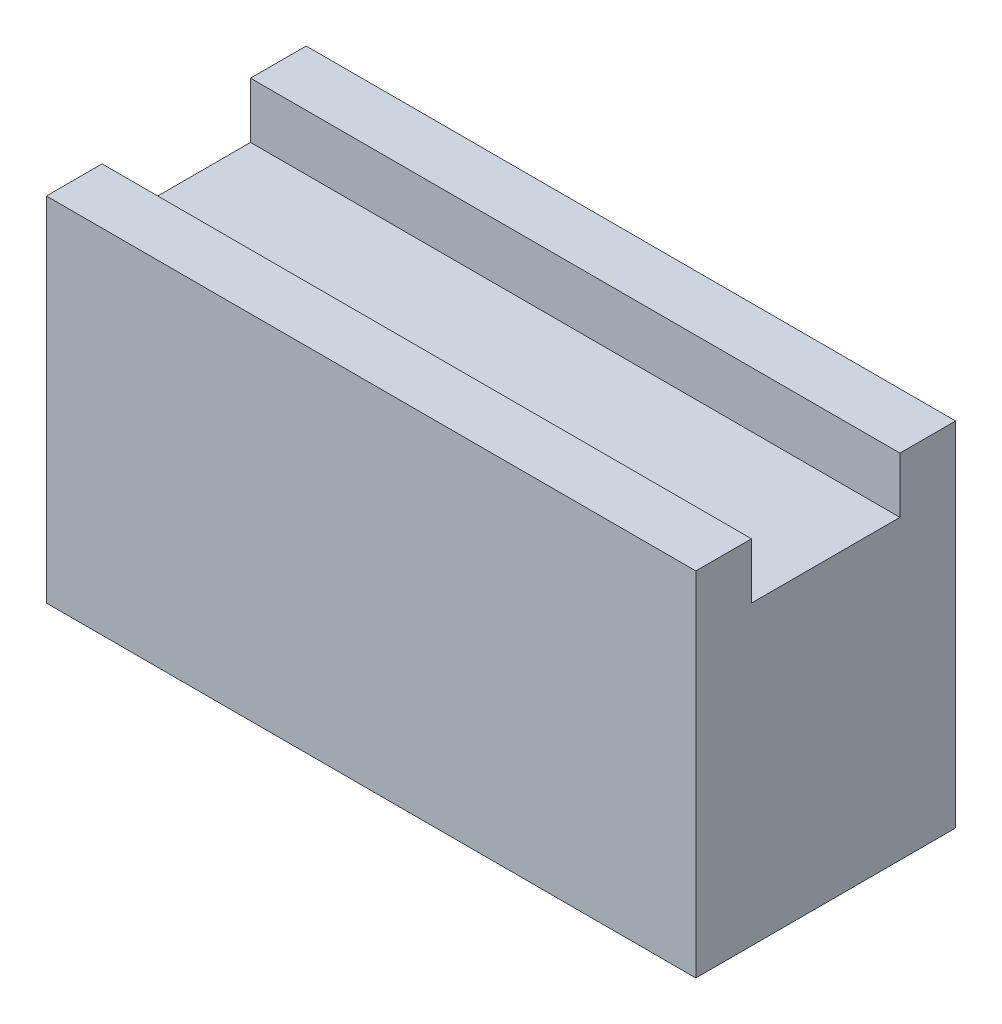
ISO-10303-21;
HEADER;
FILE_DESCRIPTION(('STEP AP214'),'2;1');
FILE_NAME('part.step','',(''),(''),'','','');
FILE_SCHEMA(('AUTOMOTIVE_DESIGN { 1 0 10303 214 1 1 1 1 }'));
ENDSEC;
DATA;
#1=APPLICATION_CONTEXT('core data for automotive mechanical design processes');
#2=APPLICATION_PROTOCOL_DEFINITION('international standard','automotive_design',2000,#1);
#3=PRODUCT_CONTEXT('',#1,'mechanical');
#4=PRODUCT('Part','Part','',(#3));
#5=PRODUCT_RELATED_PRODUCT_CATEGORY('part','',(#4));
#6=PRODUCT_DEFINITION_FORMATION('','',#4);
#7=PRODUCT_DEFINITION_CONTEXT('part definition',#1,'design');
#8=PRODUCT_DEFINITION('design','',#6,#7);
#9=PRODUCT_DEFINITION_SHAPE('','',#8);
#10=(LENGTH_UNIT() NAMED_UNIT(*) SI_UNIT(.MILLI.,.METRE.));
#11=(NAMED_UNIT(*) PLANE_ANGLE_UNIT() SI_UNIT($,.RADIAN.));
#12=(NAMED_UNIT(*) SI_UNIT($,.STERADIAN.) SOLID_ANGLE_UNIT());
#13=UNCERTAINTY_MEASURE_WITH_UNIT(LENGTH_MEASURE(1.E-05),#10,'distance_accuracy_value','');
#14=(GEOMETRIC_REPRESENTATION_CONTEXT(3) GLOBAL_UNCERTAINTY_ASSIGNED_CONTEXT((#13)) GLOBAL_UNIT_ASSIGNED_CONTEXT((#10,
#11,#12)) REPRESENTATION_CONTEXT('',''));
#15=CARTESIAN_POINT('',(0.,0.,0.));
#16=DIRECTION('',(0.,0.,1.));
#17=DIRECTION('',(1.,0.,0.));
#18=AXIS2_PLACEMENT_3D('',#15,#16,#17);
#19=CARTESIAN_POINT('',(-35.,-8.,-7.));
#20=DIRECTION('',(0.,0.,-1.));
#21=DIRECTION('',(-1.,0.,0.));
#22=AXIS2_PLACEMENT_3D('',#19,#20,#21);
#23=PLANE('',#22);
#24=DIRECTION('',(0.,1.,0.));
#25=VECTOR('',#24,1.);
#26=CARTESIAN_POINT('',(0.,-8.,-7.));
#27=LINE('',#26,#25);
#28=CARTESIAN_POINT('',(0.,-8.,-7.));
#29=VERTEX_POINT('',#28);
#30=CARTESIAN_POINT('',(0.,11.,-7.));
#31=VERTEX_POINT('',#30);
#32=EDGE_CURVE('E155',#29,#31,#27,.T.);
#33=ORIENTED_EDGE('',*,*,#32,.F.);
#34=DIRECTION('',(1.,0.,0.));
#35=VECTOR('',#34,1.);
#36=CARTESIAN_POINT('',(-35.,-8.,-7.));
#37=LINE('',#36,#35);
#38=CARTESIAN_POINT('',(-35.,-8.,-7.));
#39=VERTEX_POINT('',#38);
#40=EDGE_CURVE('E11',#39,#29,#37,.T.);
#41=ORIENTED_EDGE('',*,*,#40,.F.);
#42=DIRECTION('',(0.,1.,0.));
#43=VECTOR('',#42,1.);
#44=CARTESIAN_POINT('',(-35.,8.,-7.));
#45=LINE('',#44,#43);
#46=CARTESIAN_POINT('',(-35.,11.,-7.));
#47=VERTEX_POINT('',#46);
#48=EDGE_CURVE('E58',#39,#47,#45,.T.);
#49=ORIENTED_EDGE('',*,*,#48,.T.);
#50=DIRECTION('',(1.,0.,0.));
#51=VECTOR('',#50,1.);
#52=CARTESIAN_POINT('',(-35.,11.,-7.));
#53=LINE('',#52,#51);
#54=EDGE_CURVE('E43',#47,#31,#53,.T.);
#55=ORIENTED_EDGE('',*,*,#54,.T.);
#56=EDGE_LOOP('',(#33,#41,#49,#55));
#57=FACE_BOUND('',#56,.T.);
#58=ADVANCED_FACE('F39',(#57),#23,.T.);
#59=CARTESIAN_POINT('',(-35.,-8.,7.));
#60=DIRECTION('',(0.,-1.,0.));
#61=DIRECTION('',(0.,0.,-1.));
#62=AXIS2_PLACEMENT_3D('',#59,#60,#61);
#63=PLANE('',#62);
#64=DIRECTION('',(0.,0.,-1.));
#65=VECTOR('',#64,1.);
#66=CARTESIAN_POINT('',(0.,-8.,7.));
#67=LINE('',#66,#65);
#68=CARTESIAN_POINT('',(0.,-8.,7.));
#69=VERTEX_POINT('',#68);
#70=EDGE_CURVE('E153',#69,#29,#67,.T.);
#71=ORIENTED_EDGE('',*,*,#70,.F.);
#72=DIRECTION('',(1.,0.,0.));
#73=VECTOR('',#72,1.);
#74=CARTESIAN_POINT('',(-35.,-8.,7.));
#75=LINE('',#74,#73);
#76=CARTESIAN_POINT('',(-35.,-8.,7.));
#77=VERTEX_POINT('',#76);
#78=EDGE_CURVE('E49',#77,#69,#75,.T.);
#79=ORIENTED_EDGE('',*,*,#78,.F.);
#80=DIRECTION('',(0.,0.,-1.));
#81=VECTOR('',#80,1.);
#82=CARTESIAN_POINT('',(-35.,-8.,7.));
#83=LINE('',#82,#81);
#84=EDGE_CURVE('E128',#77,#39,#83,.T.);
#85=ORIENTED_EDGE('',*,*,#84,.T.);
#86=ORIENTED_EDGE('',*,*,#40,.T.);
#87=EDGE_LOOP('',(#71,#79,#85,#86));
#88=FACE_BOUND('',#87,.T.);
#89=ADVANCED_FACE('F168',(#88),#63,.T.);
#90=CARTESIAN_POINT('',(-35.,-8.,7.));
#91=DIRECTION('',(0.,0.,1.));
#92=DIRECTION('',(1.,0.,0.));
#93=AXIS2_PLACEMENT_3D('',#90,#91,#92);
#94=PLANE('',#93);
#95=DIRECTION('',(0.,-1.,0.));
#96=VECTOR('',#95,1.);
#97=CARTESIAN_POINT('',(0.,-8.,7.));
#98=LINE('',#97,#96);
#99=CARTESIAN_POINT('',(0.,11.,7.));
#100=VERTEX_POINT('',#99);
#101=EDGE_CURVE('E116',#100,#69,#98,.T.);
#102=ORIENTED_EDGE('',*,*,#101,.F.);
#103=DIRECTION('',(1.,0.,0.));
#104=VECTOR('',#103,1.);
#105=CARTESIAN_POINT('',(-35.,11.,7.));
#106=LINE('',#105,#104);
#107=CARTESIAN_POINT('',(-35.,11.,7.));
#108=VERTEX_POINT('',#107);
#109=EDGE_CURVE('E111',#108,#100,#106,.T.);
#110=ORIENTED_EDGE('',*,*,#109,.F.);
#111=DIRECTION('',(0.,-1.,0.));
#112=VECTOR('',#111,1.);
#113=CARTESIAN_POINT('',(-35.,8.,7.));
#114=LINE('',#113,#112);
#115=EDGE_CURVE('E114',#108,#77,#114,.T.);
#116=ORIENTED_EDGE('',*,*,#115,.T.);
#117=ORIENTED_EDGE('',*,*,#78,.T.);
#118=EDGE_LOOP('',(#102,#110,#116,#117));
#119=FACE_BOUND('',#118,.T.);
#120=ADVANCED_FACE('F113',(#119),#94,.T.);
#121=CARTESIAN_POINT('',(-35.,11.,7.));
#122=DIRECTION('',(0.,1.,0.));
#123=DIRECTION('',(0.,0.,1.));
#124=AXIS2_PLACEMENT_3D('',#121,#122,#123);
#125=PLANE('',#124);
#126=DIRECTION('',(0.,0.,1.));
#127=VECTOR('',#126,1.);
#128=CARTESIAN_POINT('',(0.,11.,7.));
#129=LINE('',#128,#127);
#130=CARTESIAN_POINT('',(0.,11.,4.));
#131=VERTEX_POINT('',#130);
#132=EDGE_CURVE('E150',#131,#100,#129,.T.);
#133=ORIENTED_EDGE('',*,*,#132,.F.);
#134=DIRECTION('',(1.,0.,0.));
#135=VECTOR('',#134,1.);
#136=CARTESIAN_POINT('',(-35.,11.,4.));
#137=LINE('',#136,#135);
#138=CARTESIAN_POINT('',(-35.,11.,4.));
#139=VERTEX_POINT('',#138);
#140=EDGE_CURVE('E121',#139,#131,#137,.T.);
#141=ORIENTED_EDGE('',*,*,#140,.F.);
#142=DIRECTION('',(0.,0.,1.));
#143=VECTOR('',#142,1.);
#144=CARTESIAN_POINT('',(-35.,11.,7.));
#145=LINE('',#144,#143);
#146=EDGE_CURVE('E126',#139,#108,#145,.T.);
#147=ORIENTED_EDGE('',*,*,#146,.T.);
#148=ORIENTED_EDGE('',*,*,#109,.T.);
#149=EDGE_LOOP('',(#133,#141,#147,#148));
#150=FACE_BOUND('',#149,.T.);
#151=ADVANCED_FACE('F130',(#150),#125,.T.);
#152=CARTESIAN_POINT('',(-35.,11.,4.));
#153=DIRECTION('',(0.,0.,-1.));
#154=DIRECTION('',(-1.,0.,0.));
#155=AXIS2_PLACEMENT_3D('',#152,#153,#154);
#156=PLANE('',#155);
#157=DIRECTION('',(0.,1.,0.));
#158=VECTOR('',#157,1.);
#159=CARTESIAN_POINT('',(0.,11.,4.));
#160=LINE('',#159,#158);
#161=CARTESIAN_POINT('',(0.,8.,4.));
#162=VERTEX_POINT('',#161);
#163=EDGE_CURVE('E147',#162,#131,#160,.T.);
#164=ORIENTED_EDGE('',*,*,#163,.F.);
#165=DIRECTION('',(1.,0.,0.));
#166=VECTOR('',#165,1.);
#167=CARTESIAN_POINT('',(-35.,8.,4.));
#168=LINE('',#167,#166);
#169=CARTESIAN_POINT('',(-35.,8.,4.));
#170=VERTEX_POINT('',#169);
#171=EDGE_CURVE('E159',#170,#162,#168,.T.);
#172=ORIENTED_EDGE('',*,*,#171,.F.);
#173=DIRECTION('',(0.,1.,0.));
#174=VECTOR('',#173,1.);
#175=CARTESIAN_POINT('',(-35.,11.,4.));
#176=LINE('',#175,#174);
#177=EDGE_CURVE('E131',#170,#139,#176,.T.);
#178=ORIENTED_EDGE('',*,*,#177,.T.);
#179=ORIENTED_EDGE('',*,*,#140,.T.);
#180=EDGE_LOOP('',(#164,#172,#178,#179));
#181=FACE_BOUND('',#180,.T.);
#182=ADVANCED_FACE('F181',(#181),#156,.T.);
#183=CARTESIAN_POINT('',(-35.,8.,4.));
#184=DIRECTION('',(0.,1.,0.));
#185=DIRECTION('',(0.,0.,1.));
#186=AXIS2_PLACEMENT_3D('',#183,#184,#185);
#187=PLANE('',#186);
#188=DIRECTION('',(0.,0.,1.));
#189=VECTOR('',#188,1.);
#190=CARTESIAN_POINT('',(0.,8.,4.));
#191=LINE('',#190,#189);
#192=CARTESIAN_POINT('',(0.,8.,-4.));
#193=VERTEX_POINT('',#192);
#194=EDGE_CURVE('E144',#193,#162,#191,.T.);
#195=ORIENTED_EDGE('',*,*,#194,.F.);
#196=DIRECTION('',(1.,0.,0.));
#197=VECTOR('',#196,1.);
#198=CARTESIAN_POINT('',(-35.,8.,-4.));
#199=LINE('',#198,#197);
#200=CARTESIAN_POINT('',(-35.,8.,-4.));
#201=VERTEX_POINT('',#200);
#202=EDGE_CURVE('E161',#201,#193,#199,.T.);
#203=ORIENTED_EDGE('',*,*,#202,.F.);
#204=DIRECTION('',(0.,0.,1.));
#205=VECTOR('',#204,1.);
#206=CARTESIAN_POINT('',(-35.,8.,4.));
#207=LINE('',#206,#205);
#208=EDGE_CURVE('E133',#201,#170,#207,.T.);
#209=ORIENTED_EDGE('',*,*,#208,.T.);
#210=ORIENTED_EDGE('',*,*,#171,.T.);
#211=EDGE_LOOP('',(#195,#203,#209,#210));
#212=FACE_BOUND('',#211,.T.);
#213=ADVANCED_FACE('F184',(#212),#187,.T.);
#214=CARTESIAN_POINT('',(-35.,11.,-4.));
#215=DIRECTION('',(0.,0.,1.));
#216=DIRECTION('',(1.,0.,0.));
#217=AXIS2_PLACEMENT_3D('',#214,#215,#216);
#218=PLANE('',#217);
#219=DIRECTION('',(0.,-1.,0.));
#220=VECTOR('',#219,1.);
#221=CARTESIAN_POINT('',(0.,11.,-4.));
#222=LINE('',#221,#220);
#223=CARTESIAN_POINT('',(0.,11.,-4.));
#224=VERTEX_POINT('',#223);
#225=EDGE_CURVE('E141',#224,#193,#222,.T.);
#226=ORIENTED_EDGE('',*,*,#225,.F.);
#227=DIRECTION('',(1.,0.,0.));
#228=VECTOR('',#227,1.);
#229=CARTESIAN_POINT('',(-35.,11.,-4.));
#230=LINE('',#229,#228);
#231=CARTESIAN_POINT('',(-35.,11.,-4.));
#232=VERTEX_POINT('',#231);
#233=EDGE_CURVE('E162',#232,#224,#230,.T.);
#234=ORIENTED_EDGE('',*,*,#233,.F.);
#235=DIRECTION('',(0.,-1.,0.));
#236=VECTOR('',#235,1.);
#237=CARTESIAN_POINT('',(-35.,11.,-4.));
#238=LINE('',#237,#236);
#239=EDGE_CURVE('E197',#232,#201,#238,.T.);
#240=ORIENTED_EDGE('',*,*,#239,.T.);
#241=ORIENTED_EDGE('',*,*,#202,.T.);
#242=EDGE_LOOP('',(#226,#234,#240,#241));
#243=FACE_BOUND('',#242,.T.);
#244=ADVANCED_FACE('F187',(#243),#218,.T.);
#245=CARTESIAN_POINT('',(-35.,11.,-7.));
#246=DIRECTION('',(0.,1.,0.));
#247=DIRECTION('',(0.,0.,1.));
#248=AXIS2_PLACEMENT_3D('',#245,#246,#247);
#249=PLANE('',#248);
#250=DIRECTION('',(0.,0.,1.));
#251=VECTOR('',#250,1.);
#252=CARTESIAN_POINT('',(0.,11.,-7.));
#253=LINE('',#252,#251);
#254=EDGE_CURVE('E138',#31,#224,#253,.T.);
#255=ORIENTED_EDGE('',*,*,#254,.F.);
#256=ORIENTED_EDGE('',*,*,#54,.F.);
#257=DIRECTION('',(0.,0.,1.));
#258=VECTOR('',#257,1.);
#259=CARTESIAN_POINT('',(-35.,11.,-7.));
#260=LINE('',#259,#258);
#261=EDGE_CURVE('E201',#47,#232,#260,.T.);
#262=ORIENTED_EDGE('',*,*,#261,.T.);
#263=ORIENTED_EDGE('',*,*,#233,.T.);
#264=EDGE_LOOP('',(#255,#256,#262,#263));
#265=FACE_BOUND('',#264,.T.);
#266=ADVANCED_FACE('F41',(#265),#249,.T.);
#267=CARTESIAN_POINT('',(-35.,0.,0.));
#268=DIRECTION('',(1.,0.,0.));
#269=DIRECTION('',(0.,0.,-1.));
#270=AXIS2_PLACEMENT_3D('',#267,#268,#269);
#271=PLANE('',#270);
#272=ORIENTED_EDGE('',*,*,#48,.F.);
#273=ORIENTED_EDGE('',*,*,#84,.F.);
#274=ORIENTED_EDGE('',*,*,#115,.F.);
#275=ORIENTED_EDGE('',*,*,#146,.F.);
#276=ORIENTED_EDGE('',*,*,#177,.F.);
#277=ORIENTED_EDGE('',*,*,#208,.F.);
#278=ORIENTED_EDGE('',*,*,#239,.F.);
#279=ORIENTED_EDGE('',*,*,#261,.F.);
#280=EDGE_LOOP('',(#272,#273,#274,#275,#276,#277,#278,#279));
#281=FACE_BOUND('',#280,.T.);
#282=ADVANCED_FACE('F124',(#281),#271,.F.);
#283=CARTESIAN_POINT('',(0.,0.,0.));
#284=DIRECTION('',(1.,0.,0.));
#285=DIRECTION('',(0.,0.,-1.));
#286=AXIS2_PLACEMENT_3D('',#283,#284,#285);
#287=PLANE('',#286);
#288=ORIENTED_EDGE('',*,*,#32,.T.);
#289=ORIENTED_EDGE('',*,*,#254,.T.);
#290=ORIENTED_EDGE('',*,*,#225,.T.);
#291=ORIENTED_EDGE('',*,*,#194,.T.);
#292=ORIENTED_EDGE('',*,*,#163,.T.);
#293=ORIENTED_EDGE('',*,*,#132,.T.);
#294=ORIENTED_EDGE('',*,*,#101,.T.);
#295=ORIENTED_EDGE('',*,*,#70,.T.);
#296=EDGE_LOOP('',(#288,#289,#290,#291,#292,#293,#294,#295));
#297=FACE_BOUND('',#296,.T.);
#298=ADVANCED_FACE('F167',(#297),#287,.T.);
#299=CLOSED_SHELL('',(#58,#89,#120,#151,#182,#213,#244,#266,#282,#298));
#300=MANIFOLD_SOLID_BREP('B2',#299);
#301=ADVANCED_BREP_SHAPE_REPRESENTATION('',(#18,#300),#14);
#302=SHAPE_DEFINITION_REPRESENTATION(#9,#301);
ENDSEC;
END-ISO-10303-21;
